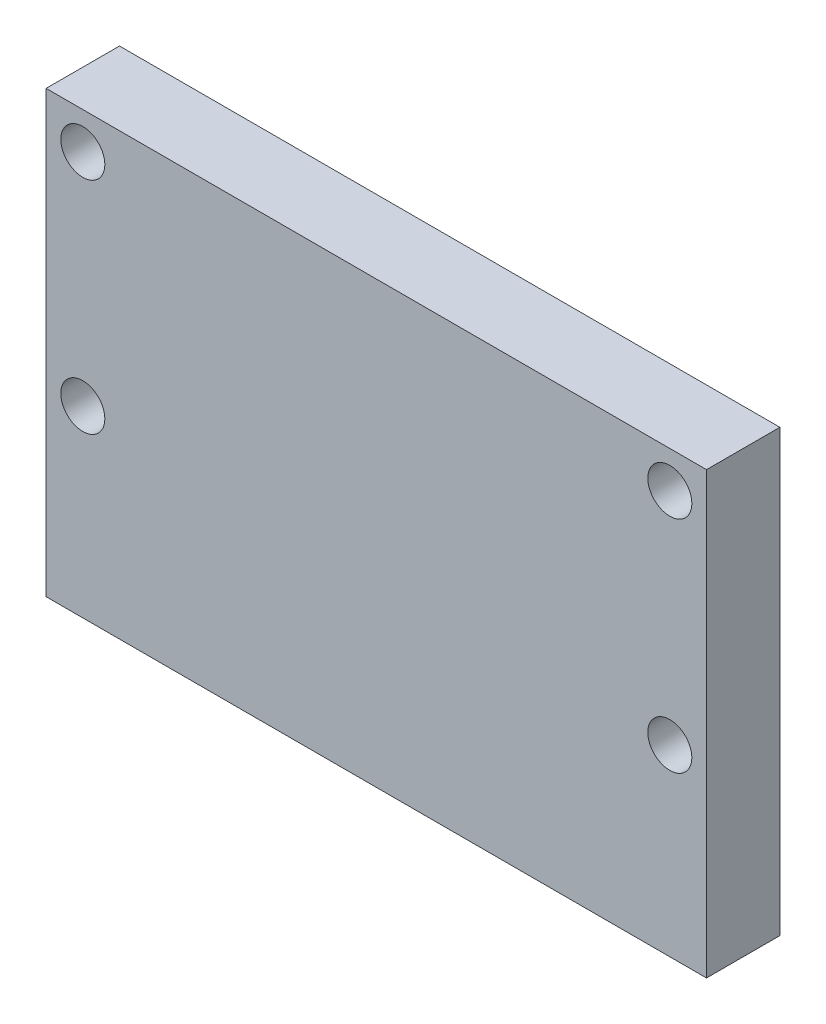
ISO-10303-21;
HEADER;
FILE_DESCRIPTION(('STEP AP214'),'2;1');
FILE_NAME('part.step','',(''),(''),'','','');
FILE_SCHEMA(('AUTOMOTIVE_DESIGN { 1 0 10303 214 1 1 1 1 }'));
ENDSEC;
DATA;
#1=APPLICATION_CONTEXT('core data for automotive mechanical design processes');
#2=APPLICATION_PROTOCOL_DEFINITION('international standard','automotive_design',2000,#1);
#3=PRODUCT_CONTEXT('',#1,'mechanical');
#4=PRODUCT('Part','Part','',(#3));
#5=PRODUCT_RELATED_PRODUCT_CATEGORY('part','',(#4));
#6=PRODUCT_DEFINITION_FORMATION('','',#4);
#7=PRODUCT_DEFINITION_CONTEXT('part definition',#1,'design');
#8=PRODUCT_DEFINITION('design','',#6,#7);
#9=PRODUCT_DEFINITION_SHAPE('','',#8);
#10=(LENGTH_UNIT() NAMED_UNIT(*) SI_UNIT(.MILLI.,.METRE.));
#11=(NAMED_UNIT(*) PLANE_ANGLE_UNIT() SI_UNIT($,.RADIAN.));
#12=(NAMED_UNIT(*) SI_UNIT($,.STERADIAN.) SOLID_ANGLE_UNIT());
#13=UNCERTAINTY_MEASURE_WITH_UNIT(LENGTH_MEASURE(1.E-05),#10,'distance_accuracy_value','');
#14=(GEOMETRIC_REPRESENTATION_CONTEXT(3) GLOBAL_UNCERTAINTY_ASSIGNED_CONTEXT((#13)) GLOBAL_UNIT_ASSIGNED_CONTEXT((#10,
#11,#12)) REPRESENTATION_CONTEXT('',''));
#15=CARTESIAN_POINT('',(0.,0.,0.));
#16=DIRECTION('',(0.,0.,1.));
#17=DIRECTION('',(1.,0.,0.));
#18=AXIS2_PLACEMENT_3D('',#15,#16,#17);
#19=CARTESIAN_POINT('',(22.5,0.,5.));
#20=DIRECTION('',(1.,0.,0.));
#21=DIRECTION('',(0.,1.,0.));
#22=AXIS2_PLACEMENT_3D('',#19,#20,#21);
#23=PLANE('',#22);
#24=DIRECTION('',(0.,-1.,0.));
#25=VECTOR('',#24,1.);
#26=CARTESIAN_POINT('',(22.5,0.,0.));
#27=LINE('',#26,#25);
#28=CARTESIAN_POINT('',(22.5,10.,0.));
#29=VERTEX_POINT('',#28);
#30=CARTESIAN_POINT('',(22.5,-20.,0.));
#31=VERTEX_POINT('',#30);
#32=EDGE_CURVE('E111',#29,#31,#27,.T.);
#33=ORIENTED_EDGE('',*,*,#32,.F.);
#34=DIRECTION('',(0.,0.,-1.));
#35=VECTOR('',#34,1.);
#36=CARTESIAN_POINT('',(22.5,10.,5.));
#37=LINE('',#36,#35);
#38=CARTESIAN_POINT('',(22.5,10.,5.));
#39=VERTEX_POINT('',#38);
#40=EDGE_CURVE('E11',#39,#29,#37,.T.);
#41=ORIENTED_EDGE('',*,*,#40,.F.);
#42=DIRECTION('',(0.,-1.,0.));
#43=VECTOR('',#42,1.);
#44=CARTESIAN_POINT('',(22.5,0.,5.));
#45=LINE('',#44,#43);
#46=CARTESIAN_POINT('',(22.5,-20.,5.));
#47=VERTEX_POINT('',#46);
#48=EDGE_CURVE('E93',#39,#47,#45,.T.);
#49=ORIENTED_EDGE('',*,*,#48,.T.);
#50=DIRECTION('',(0.,0.,-1.));
#51=VECTOR('',#50,1.);
#52=CARTESIAN_POINT('',(22.5,-20.,5.));
#53=LINE('',#52,#51);
#54=EDGE_CURVE('E73',#47,#31,#53,.T.);
#55=ORIENTED_EDGE('',*,*,#54,.T.);
#56=EDGE_LOOP('',(#33,#41,#49,#55));
#57=FACE_BOUND('',#56,.T.);
#58=ADVANCED_FACE('F35',(#57),#23,.T.);
#59=CARTESIAN_POINT('',(0.,10.,5.));
#60=DIRECTION('',(0.,1.,0.));
#61=DIRECTION('',(0.,0.,1.));
#62=AXIS2_PLACEMENT_3D('',#59,#60,#61);
#63=PLANE('',#62);
#64=DIRECTION('',(1.,0.,0.));
#65=VECTOR('',#64,1.);
#66=CARTESIAN_POINT('',(0.,10.,0.));
#67=LINE('',#66,#65);
#68=CARTESIAN_POINT('',(-22.5,10.,0.));
#69=VERTEX_POINT('',#68);
#70=EDGE_CURVE('E86',#69,#29,#67,.T.);
#71=ORIENTED_EDGE('',*,*,#70,.F.);
#72=DIRECTION('',(0.,0.,-1.));
#73=VECTOR('',#72,1.);
#74=CARTESIAN_POINT('',(-22.5,10.,5.));
#75=LINE('',#74,#73);
#76=CARTESIAN_POINT('',(-22.5,10.,5.));
#77=VERTEX_POINT('',#76);
#78=EDGE_CURVE('E43',#77,#69,#75,.T.);
#79=ORIENTED_EDGE('',*,*,#78,.F.);
#80=DIRECTION('',(1.,0.,0.));
#81=VECTOR('',#80,1.);
#82=CARTESIAN_POINT('',(0.,10.,5.));
#83=LINE('',#82,#81);
#84=EDGE_CURVE('E84',#77,#39,#83,.T.);
#85=ORIENTED_EDGE('',*,*,#84,.T.);
#86=ORIENTED_EDGE('',*,*,#40,.T.);
#87=EDGE_LOOP('',(#71,#79,#85,#86));
#88=FACE_BOUND('',#87,.T.);
#89=ADVANCED_FACE('F82',(#88),#63,.T.);
#90=CARTESIAN_POINT('',(-22.5,0.,5.));
#91=DIRECTION('',(1.,0.,0.));
#92=DIRECTION('',(0.,1.,0.));
#93=AXIS2_PLACEMENT_3D('',#90,#91,#92);
#94=PLANE('',#93);
#95=DIRECTION('',(0.,-1.,0.));
#96=VECTOR('',#95,1.);
#97=CARTESIAN_POINT('',(-22.5,0.,0.));
#98=LINE('',#97,#96);
#99=CARTESIAN_POINT('',(-22.5,-20.,0.));
#100=VERTEX_POINT('',#99);
#101=EDGE_CURVE('E66',#69,#100,#98,.T.);
#102=ORIENTED_EDGE('',*,*,#101,.T.);
#103=DIRECTION('',(0.,0.,-1.));
#104=VECTOR('',#103,1.);
#105=CARTESIAN_POINT('',(-22.5,-20.,5.));
#106=LINE('',#105,#104);
#107=CARTESIAN_POINT('',(-22.5,-20.,5.));
#108=VERTEX_POINT('',#107);
#109=EDGE_CURVE('E87',#108,#100,#106,.T.);
#110=ORIENTED_EDGE('',*,*,#109,.F.);
#111=DIRECTION('',(0.,-1.,0.));
#112=VECTOR('',#111,1.);
#113=CARTESIAN_POINT('',(-22.5,0.,5.));
#114=LINE('',#113,#112);
#115=EDGE_CURVE('E88',#77,#108,#114,.T.);
#116=ORIENTED_EDGE('',*,*,#115,.F.);
#117=ORIENTED_EDGE('',*,*,#78,.T.);
#118=EDGE_LOOP('',(#102,#110,#116,#117));
#119=FACE_BOUND('',#118,.T.);
#120=ADVANCED_FACE('F89',(#119),#94,.F.);
#121=CARTESIAN_POINT('',(-20.,-7.5,5.));
#122=DIRECTION('',(0.,0.,-1.));
#123=DIRECTION('',(-1.,0.,0.));
#124=AXIS2_PLACEMENT_3D('',#121,#122,#123);
#125=CYLINDRICAL_SURFACE('',#124,1.5);
#126=CARTESIAN_POINT('',(-20.,-7.5,5.));
#127=DIRECTION('',(0.,0.,1.));
#128=DIRECTION('',(1.,0.,0.));
#129=AXIS2_PLACEMENT_3D('',#126,#127,#128);
#130=CIRCLE('',#129,1.5);
#131=CARTESIAN_POINT('',(-18.5,-7.5,5.));
#132=VERTEX_POINT('',#131);
#133=EDGE_CURVE('E105',#132,#132,#130,.T.);
#134=ORIENTED_EDGE('',*,*,#133,.T.);
#135=EDGE_LOOP('',(#134));
#136=FACE_BOUND('',#135,.T.);
#137=CARTESIAN_POINT('',(-20.,-7.5,0.));
#138=DIRECTION('',(0.,0.,1.));
#139=DIRECTION('',(1.,0.,0.));
#140=AXIS2_PLACEMENT_3D('',#137,#138,#139);
#141=CIRCLE('',#140,1.5);
#142=CARTESIAN_POINT('',(-18.5,-7.5,0.));
#143=VERTEX_POINT('',#142);
#144=EDGE_CURVE('E124',#143,#143,#141,.T.);
#145=ORIENTED_EDGE('',*,*,#144,.F.);
#146=EDGE_LOOP('',(#145));
#147=FACE_BOUND('',#146,.T.);
#148=ADVANCED_FACE('F143',(#136,#147),#125,.F.);
#149=CARTESIAN_POINT('',(20.,7.5,5.));
#150=DIRECTION('',(0.,0.,-1.));
#151=DIRECTION('',(-1.,0.,0.));
#152=AXIS2_PLACEMENT_3D('',#149,#150,#151);
#153=CYLINDRICAL_SURFACE('',#152,1.5);
#154=CARTESIAN_POINT('',(20.,7.5,5.));
#155=DIRECTION('',(0.,0.,1.));
#156=DIRECTION('',(1.,0.,0.));
#157=AXIS2_PLACEMENT_3D('',#154,#155,#156);
#158=CIRCLE('',#157,1.5);
#159=CARTESIAN_POINT('',(21.5,7.5,5.));
#160=VERTEX_POINT('',#159);
#161=EDGE_CURVE('E102',#160,#160,#158,.T.);
#162=ORIENTED_EDGE('',*,*,#161,.T.);
#163=EDGE_LOOP('',(#162));
#164=FACE_BOUND('',#163,.T.);
#165=CARTESIAN_POINT('',(20.,7.5,0.));
#166=DIRECTION('',(0.,0.,1.));
#167=DIRECTION('',(1.,0.,0.));
#168=AXIS2_PLACEMENT_3D('',#165,#166,#167);
#169=CIRCLE('',#168,1.5);
#170=CARTESIAN_POINT('',(21.5,7.5,0.));
#171=VERTEX_POINT('',#170);
#172=EDGE_CURVE('E121',#171,#171,#169,.T.);
#173=ORIENTED_EDGE('',*,*,#172,.F.);
#174=EDGE_LOOP('',(#173));
#175=FACE_BOUND('',#174,.T.);
#176=ADVANCED_FACE('F152',(#164,#175),#153,.F.);
#177=CARTESIAN_POINT('',(20.,-7.5,5.));
#178=DIRECTION('',(0.,0.,-1.));
#179=DIRECTION('',(-1.,0.,0.));
#180=AXIS2_PLACEMENT_3D('',#177,#178,#179);
#181=CYLINDRICAL_SURFACE('',#180,1.5);
#182=CARTESIAN_POINT('',(20.,-7.5,5.));
#183=DIRECTION('',(0.,0.,1.));
#184=DIRECTION('',(1.,0.,0.));
#185=AXIS2_PLACEMENT_3D('',#182,#183,#184);
#186=CIRCLE('',#185,1.5);
#187=CARTESIAN_POINT('',(21.5,-7.5,5.));
#188=VERTEX_POINT('',#187);
#189=EDGE_CURVE('E99',#188,#188,#186,.T.);
#190=ORIENTED_EDGE('',*,*,#189,.T.);
#191=EDGE_LOOP('',(#190));
#192=FACE_BOUND('',#191,.T.);
#193=CARTESIAN_POINT('',(20.,-7.5,0.));
#194=DIRECTION('',(0.,0.,1.));
#195=DIRECTION('',(1.,0.,0.));
#196=AXIS2_PLACEMENT_3D('',#193,#194,#195);
#197=CIRCLE('',#196,1.5);
#198=CARTESIAN_POINT('',(21.5,-7.5,0.));
#199=VERTEX_POINT('',#198);
#200=EDGE_CURVE('E118',#199,#199,#197,.T.);
#201=ORIENTED_EDGE('',*,*,#200,.F.);
#202=EDGE_LOOP('',(#201));
#203=FACE_BOUND('',#202,.T.);
#204=ADVANCED_FACE('F149',(#192,#203),#181,.F.);
#205=CARTESIAN_POINT('',(0.,-20.,5.));
#206=DIRECTION('',(0.,1.,0.));
#207=DIRECTION('',(0.,0.,1.));
#208=AXIS2_PLACEMENT_3D('',#205,#206,#207);
#209=PLANE('',#208);
#210=DIRECTION('',(1.,0.,0.));
#211=VECTOR('',#210,1.);
#212=CARTESIAN_POINT('',(0.,-20.,0.));
#213=LINE('',#212,#211);
#214=EDGE_CURVE('E116',#100,#31,#213,.T.);
#215=ORIENTED_EDGE('',*,*,#214,.T.);
#216=ORIENTED_EDGE('',*,*,#54,.F.);
#217=DIRECTION('',(1.,0.,0.));
#218=VECTOR('',#217,1.);
#219=CARTESIAN_POINT('',(0.,-20.,5.));
#220=LINE('',#219,#218);
#221=EDGE_CURVE('E51',#108,#47,#220,.T.);
#222=ORIENTED_EDGE('',*,*,#221,.F.);
#223=ORIENTED_EDGE('',*,*,#109,.T.);
#224=EDGE_LOOP('',(#215,#216,#222,#223));
#225=FACE_BOUND('',#224,.T.);
#226=ADVANCED_FACE('F132',(#225),#209,.F.);
#227=CARTESIAN_POINT('',(-20.,7.5,5.));
#228=DIRECTION('',(0.,0.,-1.));
#229=DIRECTION('',(-1.,0.,0.));
#230=AXIS2_PLACEMENT_3D('',#227,#228,#229);
#231=CYLINDRICAL_SURFACE('',#230,1.5);
#232=CARTESIAN_POINT('',(-20.,7.5,5.));
#233=DIRECTION('',(0.,0.,1.));
#234=DIRECTION('',(1.,0.,0.));
#235=AXIS2_PLACEMENT_3D('',#232,#233,#234);
#236=CIRCLE('',#235,1.5);
#237=CARTESIAN_POINT('',(-18.5,7.5,5.));
#238=VERTEX_POINT('',#237);
#239=EDGE_CURVE('E108',#238,#238,#236,.T.);
#240=ORIENTED_EDGE('',*,*,#239,.T.);
#241=EDGE_LOOP('',(#240));
#242=FACE_BOUND('',#241,.T.);
#243=CARTESIAN_POINT('',(-20.,7.5,0.));
#244=DIRECTION('',(0.,0.,1.));
#245=DIRECTION('',(1.,0.,0.));
#246=AXIS2_PLACEMENT_3D('',#243,#244,#245);
#247=CIRCLE('',#246,1.5);
#248=CARTESIAN_POINT('',(-18.5,7.5,0.));
#249=VERTEX_POINT('',#248);
#250=EDGE_CURVE('E95',#249,#249,#247,.T.);
#251=ORIENTED_EDGE('',*,*,#250,.F.);
#252=EDGE_LOOP('',(#251));
#253=FACE_BOUND('',#252,.T.);
#254=ADVANCED_FACE('F148',(#242,#253),#231,.F.);
#255=CARTESIAN_POINT('',(0.,0.,5.));
#256=DIRECTION('',(0.,0.,1.));
#257=DIRECTION('',(1.,0.,0.));
#258=AXIS2_PLACEMENT_3D('',#255,#256,#257);
#259=PLANE('',#258);
#260=ORIENTED_EDGE('',*,*,#48,.F.);
#261=ORIENTED_EDGE('',*,*,#84,.F.);
#262=ORIENTED_EDGE('',*,*,#115,.T.);
#263=ORIENTED_EDGE('',*,*,#221,.T.);
#264=EDGE_LOOP('',(#260,#261,#262,#263));
#265=FACE_BOUND('',#264,.T.);
#266=ORIENTED_EDGE('',*,*,#189,.F.);
#267=EDGE_LOOP('',(#266));
#268=FACE_BOUND('',#267,.T.);
#269=ORIENTED_EDGE('',*,*,#161,.F.);
#270=EDGE_LOOP('',(#269));
#271=FACE_BOUND('',#270,.T.);
#272=ORIENTED_EDGE('',*,*,#133,.F.);
#273=EDGE_LOOP('',(#272));
#274=FACE_BOUND('',#273,.T.);
#275=ORIENTED_EDGE('',*,*,#239,.F.);
#276=EDGE_LOOP('',(#275));
#277=FACE_BOUND('',#276,.T.);
#278=ADVANCED_FACE('F91',(#265,#268,#271,#274,#277),#259,.T.);
#279=CARTESIAN_POINT('',(0.,0.,0.));
#280=DIRECTION('',(0.,0.,1.));
#281=DIRECTION('',(1.,0.,0.));
#282=AXIS2_PLACEMENT_3D('',#279,#280,#281);
#283=PLANE('',#282);
#284=ORIENTED_EDGE('',*,*,#32,.T.);
#285=ORIENTED_EDGE('',*,*,#214,.F.);
#286=ORIENTED_EDGE('',*,*,#101,.F.);
#287=ORIENTED_EDGE('',*,*,#70,.T.);
#288=EDGE_LOOP('',(#284,#285,#286,#287));
#289=FACE_BOUND('',#288,.T.);
#290=ORIENTED_EDGE('',*,*,#200,.T.);
#291=EDGE_LOOP('',(#290));
#292=FACE_BOUND('',#291,.T.);
#293=ORIENTED_EDGE('',*,*,#172,.T.);
#294=EDGE_LOOP('',(#293));
#295=FACE_BOUND('',#294,.T.);
#296=ORIENTED_EDGE('',*,*,#144,.T.);
#297=EDGE_LOOP('',(#296));
#298=FACE_BOUND('',#297,.T.);
#299=ORIENTED_EDGE('',*,*,#250,.T.);
#300=EDGE_LOOP('',(#299));
#301=FACE_BOUND('',#300,.T.);
#302=ADVANCED_FACE('F134',(#289,#292,#295,#298,#301),#283,.F.);
#303=CLOSED_SHELL('',(#58,#89,#120,#148,#176,#204,#226,#254,#278,#302));
#304=MANIFOLD_SOLID_BREP('B2',#303);
#305=ADVANCED_BREP_SHAPE_REPRESENTATION('',(#18,#304),#14);
#306=SHAPE_DEFINITION_REPRESENTATION(#9,#305);
ENDSEC;
END-ISO-10303-21;
